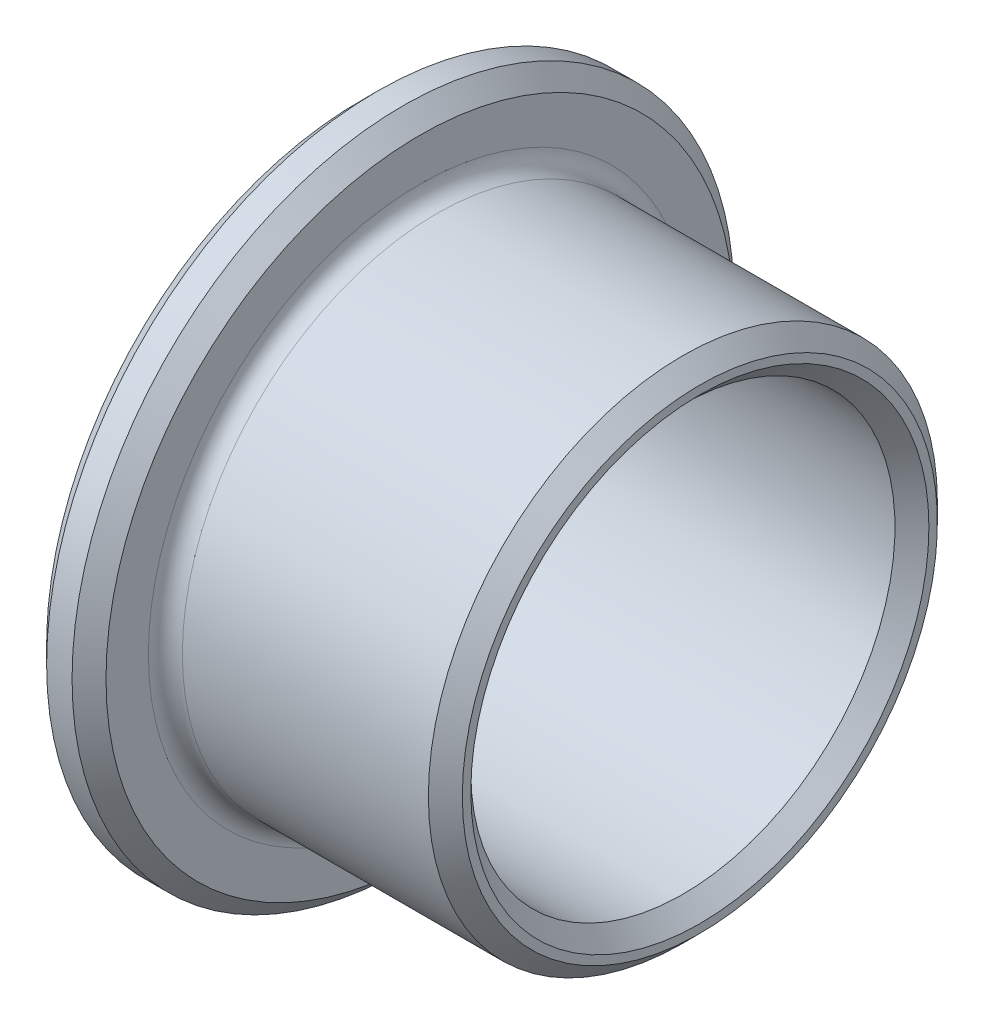
ISO-10303-21;
HEADER;
FILE_DESCRIPTION(('STEP AP214'),'2;1');
FILE_NAME('part.step','',(''),(''),'','','');
FILE_SCHEMA(('AUTOMOTIVE_DESIGN { 1 0 10303 214 1 1 1 1 }'));
ENDSEC;
DATA;
#1=APPLICATION_CONTEXT('core data for automotive mechanical design processes');
#2=APPLICATION_PROTOCOL_DEFINITION('international standard','automotive_design',2000,#1);
#3=PRODUCT_CONTEXT('',#1,'mechanical');
#4=PRODUCT('Part','Part','',(#3));
#5=PRODUCT_RELATED_PRODUCT_CATEGORY('part','',(#4));
#6=PRODUCT_DEFINITION_FORMATION('','',#4);
#7=PRODUCT_DEFINITION_CONTEXT('part definition',#1,'design');
#8=PRODUCT_DEFINITION('design','',#6,#7);
#9=PRODUCT_DEFINITION_SHAPE('','',#8);
#10=(LENGTH_UNIT() NAMED_UNIT(*) SI_UNIT(.MILLI.,.METRE.));
#11=(NAMED_UNIT(*) PLANE_ANGLE_UNIT() SI_UNIT($,.RADIAN.));
#12=(NAMED_UNIT(*) SI_UNIT($,.STERADIAN.) SOLID_ANGLE_UNIT());
#13=UNCERTAINTY_MEASURE_WITH_UNIT(LENGTH_MEASURE(1.E-05),#10,'distance_accuracy_value','');
#14=(GEOMETRIC_REPRESENTATION_CONTEXT(3) GLOBAL_UNCERTAINTY_ASSIGNED_CONTEXT((#13)) GLOBAL_UNIT_ASSIGNED_CONTEXT((#10,
#11,#12)) REPRESENTATION_CONTEXT('',''));
#15=CARTESIAN_POINT('',(0.,0.,0.));
#16=DIRECTION('',(0.,0.,1.));
#17=DIRECTION('',(1.,0.,0.));
#18=AXIS2_PLACEMENT_3D('',#15,#16,#17);
#19=CARTESIAN_POINT('',(0.,19.5,0.));
#20=DIRECTION('',(1.,0.,0.));
#21=DIRECTION('',(0.,0.,-1.));
#22=AXIS2_PLACEMENT_3D('',#19,#20,#21);
#23=PLANE('',#22);
#24=CARTESIAN_POINT('',(0.,0.,0.));
#25=DIRECTION('',(1.,0.,0.));
#26=DIRECTION('',(0.,0.,-1.));
#27=AXIS2_PLACEMENT_3D('',#24,#25,#26);
#28=CIRCLE('',#27,13.5);
#29=CARTESIAN_POINT('',(0.,0.,-13.5));
#30=VERTEX_POINT('',#29);
#31=EDGE_CURVE('E67',#30,#30,#28,.T.);
#32=ORIENTED_EDGE('',*,*,#31,.T.);
#33=EDGE_LOOP('',(#32));
#34=FACE_BOUND('',#33,.T.);
#35=CARTESIAN_POINT('',(0.,0.,0.));
#36=DIRECTION('',(1.,0.,0.));
#37=DIRECTION('',(0.,0.,-1.));
#38=AXIS2_PLACEMENT_3D('',#35,#36,#37);
#39=CIRCLE('',#38,18.5);
#40=CARTESIAN_POINT('',(0.,0.,-18.5));
#41=VERTEX_POINT('',#40);
#42=EDGE_CURVE('E70',#41,#41,#39,.F.);
#43=ORIENTED_EDGE('',*,*,#42,.T.);
#44=EDGE_LOOP('',(#43));
#45=FACE_BOUND('',#44,.T.);
#46=ADVANCED_FACE('F35',(#34,#45),#23,.F.);
#47=CARTESIAN_POINT('',(0.,0.,0.));
#48=DIRECTION('',(-1.,0.,0.));
#49=DIRECTION('',(0.,0.,1.));
#50=AXIS2_PLACEMENT_3D('',#47,#48,#49);
#51=CYLINDRICAL_SURFACE('',#50,12.5);
#52=CARTESIAN_POINT('',(1.00000000000001,0.,0.));
#53=DIRECTION('',(1.,0.,0.));
#54=DIRECTION('',(0.,0.,-1.));
#55=AXIS2_PLACEMENT_3D('',#52,#53,#54);
#56=CIRCLE('',#55,12.5);
#57=CARTESIAN_POINT('',(1.00000000000001,0.,-12.5));
#58=VERTEX_POINT('',#57);
#59=EDGE_CURVE('E73',#58,#58,#56,.F.);
#60=ORIENTED_EDGE('',*,*,#59,.T.);
#61=EDGE_LOOP('',(#60));
#62=FACE_BOUND('',#61,.T.);
#63=CARTESIAN_POINT('',(19.,0.,0.));
#64=DIRECTION('',(-1.,0.,0.));
#65=DIRECTION('',(0.,0.,1.));
#66=AXIS2_PLACEMENT_3D('',#63,#64,#65);
#67=CIRCLE('',#66,12.5);
#68=CARTESIAN_POINT('',(19.,0.,12.5));
#69=VERTEX_POINT('',#68);
#70=EDGE_CURVE('E76',#69,#69,#67,.F.);
#71=ORIENTED_EDGE('',*,*,#70,.T.);
#72=EDGE_LOOP('',(#71));
#73=FACE_BOUND('',#72,.T.);
#74=ADVANCED_FACE('F80',(#62,#73),#51,.F.);
#75=CARTESIAN_POINT('',(20.,12.5,0.));
#76=DIRECTION('',(-1.,0.,0.));
#77=DIRECTION('',(0.,0.,1.));
#78=AXIS2_PLACEMENT_3D('',#75,#76,#77);
#79=PLANE('',#78);
#80=CARTESIAN_POINT('',(20.,0.,0.));
#81=DIRECTION('',(-1.,0.,0.));
#82=DIRECTION('',(0.,0.,1.));
#83=AXIS2_PLACEMENT_3D('',#80,#81,#82);
#84=CIRCLE('',#83,13.5);
#85=CARTESIAN_POINT('',(20.,0.,13.5));
#86=VERTEX_POINT('',#85);
#87=EDGE_CURVE('E61',#86,#86,#84,.T.);
#88=ORIENTED_EDGE('',*,*,#87,.T.);
#89=EDGE_LOOP('',(#88));
#90=FACE_BOUND('',#89,.T.);
#91=CARTESIAN_POINT('',(20.,0.,0.));
#92=DIRECTION('',(-1.,0.,0.));
#93=DIRECTION('',(0.,0.,1.));
#94=AXIS2_PLACEMENT_3D('',#91,#92,#93);
#95=CIRCLE('',#94,14.);
#96=CARTESIAN_POINT('',(20.,0.,14.));
#97=VERTEX_POINT('',#96);
#98=EDGE_CURVE('E64',#97,#97,#95,.F.);
#99=ORIENTED_EDGE('',*,*,#98,.T.);
#100=EDGE_LOOP('',(#99));
#101=FACE_BOUND('',#100,.T.);
#102=ADVANCED_FACE('F90',(#90,#101),#79,.F.);
#103=CARTESIAN_POINT('',(0.,0.,0.));
#104=DIRECTION('',(-1.,0.,0.));
#105=DIRECTION('',(0.,0.,1.));
#106=AXIS2_PLACEMENT_3D('',#103,#104,#105);
#107=CYLINDRICAL_SURFACE('',#106,15.);
#108=CARTESIAN_POINT('',(4.5,0.,0.));
#109=DIRECTION('',(-1.,0.,0.));
#110=DIRECTION('',(0.,0.,1.));
#111=AXIS2_PLACEMENT_3D('',#108,#109,#110);
#112=CIRCLE('',#111,15.);
#113=CARTESIAN_POINT('',(4.5,0.,15.));
#114=VERTEX_POINT('',#113);
#115=EDGE_CURVE('E10',#114,#114,#112,.F.);
#116=ORIENTED_EDGE('',*,*,#115,.T.);
#117=EDGE_LOOP('',(#116));
#118=FACE_BOUND('',#117,.T.);
#119=CARTESIAN_POINT('',(19.,0.,0.));
#120=DIRECTION('',(-1.,0.,0.));
#121=DIRECTION('',(0.,0.,1.));
#122=AXIS2_PLACEMENT_3D('',#119,#120,#121);
#123=CIRCLE('',#122,15.);
#124=CARTESIAN_POINT('',(19.,0.,15.));
#125=VERTEX_POINT('',#124);
#126=EDGE_CURVE('E46',#125,#125,#123,.T.);
#127=ORIENTED_EDGE('',*,*,#126,.T.);
#128=EDGE_LOOP('',(#127));
#129=FACE_BOUND('',#128,.T.);
#130=ADVANCED_FACE('F93',(#118,#129),#107,.T.);
#131=CARTESIAN_POINT('',(3.5,15.,0.));
#132=DIRECTION('',(-1.,0.,0.));
#133=DIRECTION('',(0.,0.,1.));
#134=AXIS2_PLACEMENT_3D('',#131,#132,#133);
#135=PLANE('',#134);
#136=CARTESIAN_POINT('',(3.5,0.,0.));
#137=DIRECTION('',(-1.,0.,0.));
#138=DIRECTION('',(0.,0.,1.));
#139=AXIS2_PLACEMENT_3D('',#136,#137,#138);
#140=CIRCLE('',#139,16.);
#141=CARTESIAN_POINT('',(3.5,0.,16.));
#142=VERTEX_POINT('',#141);
#143=EDGE_CURVE('E42',#142,#142,#140,.T.);
#144=ORIENTED_EDGE('',*,*,#143,.T.);
#145=EDGE_LOOP('',(#144));
#146=FACE_BOUND('',#145,.T.);
#147=CARTESIAN_POINT('',(3.5,0.,0.));
#148=DIRECTION('',(-1.,0.,0.));
#149=DIRECTION('',(0.,0.,1.));
#150=AXIS2_PLACEMENT_3D('',#147,#148,#149);
#151=CIRCLE('',#150,18.5);
#152=CARTESIAN_POINT('',(3.5,0.,18.5));
#153=VERTEX_POINT('',#152);
#154=EDGE_CURVE('E50',#153,#153,#151,.F.);
#155=ORIENTED_EDGE('',*,*,#154,.T.);
#156=EDGE_LOOP('',(#155));
#157=FACE_BOUND('',#156,.T.);
#158=ADVANCED_FACE('F104',(#146,#157),#135,.F.);
#159=CARTESIAN_POINT('',(0.,0.,0.));
#160=DIRECTION('',(-1.,0.,0.));
#161=DIRECTION('',(0.,0.,1.));
#162=AXIS2_PLACEMENT_3D('',#159,#160,#161);
#163=CYLINDRICAL_SURFACE('',#162,19.5);
#164=CARTESIAN_POINT('',(2.49999999999999,0.,0.));
#165=DIRECTION('',(-1.,0.,0.));
#166=DIRECTION('',(0.,0.,1.));
#167=AXIS2_PLACEMENT_3D('',#164,#165,#166);
#168=CIRCLE('',#167,19.5);
#169=CARTESIAN_POINT('',(2.49999999999999,0.,19.5));
#170=VERTEX_POINT('',#169);
#171=EDGE_CURVE('E55',#170,#170,#168,.T.);
#172=ORIENTED_EDGE('',*,*,#171,.T.);
#173=EDGE_LOOP('',(#172));
#174=FACE_BOUND('',#173,.T.);
#175=CARTESIAN_POINT('',(1.00000000000001,0.,0.));
#176=DIRECTION('',(1.,0.,0.));
#177=DIRECTION('',(0.,0.,-1.));
#178=AXIS2_PLACEMENT_3D('',#175,#176,#177);
#179=CIRCLE('',#178,19.5);
#180=CARTESIAN_POINT('',(1.00000000000001,0.,-19.5));
#181=VERTEX_POINT('',#180);
#182=EDGE_CURVE('E58',#181,#181,#179,.T.);
#183=ORIENTED_EDGE('',*,*,#182,.T.);
#184=EDGE_LOOP('',(#183));
#185=FACE_BOUND('',#184,.T.);
#186=ADVANCED_FACE('F109',(#174,#185),#163,.T.);
#187=CARTESIAN_POINT('',(1.00000000000001,0.,0.));
#188=DIRECTION('',(-1.,0.,0.));
#189=DIRECTION('',(0.,0.,1.));
#190=AXIS2_PLACEMENT_3D('',#187,#188,#189);
#191=CONICAL_SURFACE('',#190,12.5,0.785398163397451);
#192=ORIENTED_EDGE('',*,*,#31,.F.);
#193=EDGE_LOOP('',(#192));
#194=FACE_BOUND('',#193,.T.);
#195=ORIENTED_EDGE('',*,*,#59,.F.);
#196=EDGE_LOOP('',(#195));
#197=FACE_BOUND('',#196,.T.);
#198=ADVANCED_FACE('F86',(#194,#197),#191,.F.);
#199=CARTESIAN_POINT('',(20.,0.,0.));
#200=DIRECTION('',(1.,0.,0.));
#201=DIRECTION('',(0.,0.,-1.));
#202=AXIS2_PLACEMENT_3D('',#199,#200,#201);
#203=CONICAL_SURFACE('',#202,13.5,0.785398163397448);
#204=ORIENTED_EDGE('',*,*,#70,.F.);
#205=EDGE_LOOP('',(#204));
#206=FACE_BOUND('',#205,.T.);
#207=ORIENTED_EDGE('',*,*,#87,.F.);
#208=EDGE_LOOP('',(#207));
#209=FACE_BOUND('',#208,.T.);
#210=ADVANCED_FACE('F82',(#206,#209),#203,.F.);
#211=CARTESIAN_POINT('',(2.49999999999999,0.,0.));
#212=DIRECTION('',(-1.,0.,0.));
#213=DIRECTION('',(0.,0.,1.));
#214=AXIS2_PLACEMENT_3D('',#211,#212,#213);
#215=CONICAL_SURFACE('',#214,19.5,0.785398163397452);
#216=ORIENTED_EDGE('',*,*,#154,.F.);
#217=EDGE_LOOP('',(#216));
#218=FACE_BOUND('',#217,.T.);
#219=ORIENTED_EDGE('',*,*,#171,.F.);
#220=EDGE_LOOP('',(#219));
#221=FACE_BOUND('',#220,.T.);
#222=ADVANCED_FACE('F85',(#218,#221),#215,.T.);
#223=CARTESIAN_POINT('',(0.,0.,0.));
#224=DIRECTION('',(1.,0.,0.));
#225=DIRECTION('',(0.,0.,-1.));
#226=AXIS2_PLACEMENT_3D('',#223,#224,#225);
#227=CONICAL_SURFACE('',#226,18.5,0.785398163397447);
#228=ORIENTED_EDGE('',*,*,#182,.F.);
#229=EDGE_LOOP('',(#228));
#230=FACE_BOUND('',#229,.T.);
#231=ORIENTED_EDGE('',*,*,#42,.F.);
#232=EDGE_LOOP('',(#231));
#233=FACE_BOUND('',#232,.T.);
#234=ADVANCED_FACE('F100',(#230,#233),#227,.T.);
#235=CARTESIAN_POINT('',(19.,0.,0.));
#236=DIRECTION('',(-1.,0.,0.));
#237=DIRECTION('',(0.,0.,1.));
#238=AXIS2_PLACEMENT_3D('',#235,#236,#237);
#239=CONICAL_SURFACE('',#238,15.,0.785398163397449);
#240=ORIENTED_EDGE('',*,*,#98,.F.);
#241=EDGE_LOOP('',(#240));
#242=FACE_BOUND('',#241,.T.);
#243=ORIENTED_EDGE('',*,*,#126,.F.);
#244=EDGE_LOOP('',(#243));
#245=FACE_BOUND('',#244,.T.);
#246=ADVANCED_FACE('F97',(#242,#245),#239,.T.);
#247=CARTESIAN_POINT('',(4.5,0.,0.));
#248=DIRECTION('',(-1.,0.,0.));
#249=DIRECTION('',(0.,0.,1.));
#250=AXIS2_PLACEMENT_3D('',#247,#248,#249);
#251=TOROIDAL_SURFACE('',#250,16.,1.);
#252=ORIENTED_EDGE('',*,*,#115,.F.);
#253=EDGE_LOOP('',(#252));
#254=FACE_BOUND('',#253,.T.);
#255=ORIENTED_EDGE('',*,*,#143,.F.);
#256=EDGE_LOOP('',(#255));
#257=FACE_BOUND('',#256,.T.);
#258=ADVANCED_FACE('F37',(#254,#257),#251,.F.);
#259=CLOSED_SHELL('',(#46,#74,#102,#130,#158,#186,#198,#210,#222,#234,#246,#258));
#260=MANIFOLD_SOLID_BREP('B2',#259);
#261=ADVANCED_BREP_SHAPE_REPRESENTATION('',(#18,#260),#14);
#262=SHAPE_DEFINITION_REPRESENTATION(#9,#261);
ENDSEC;
END-ISO-10303-21;
